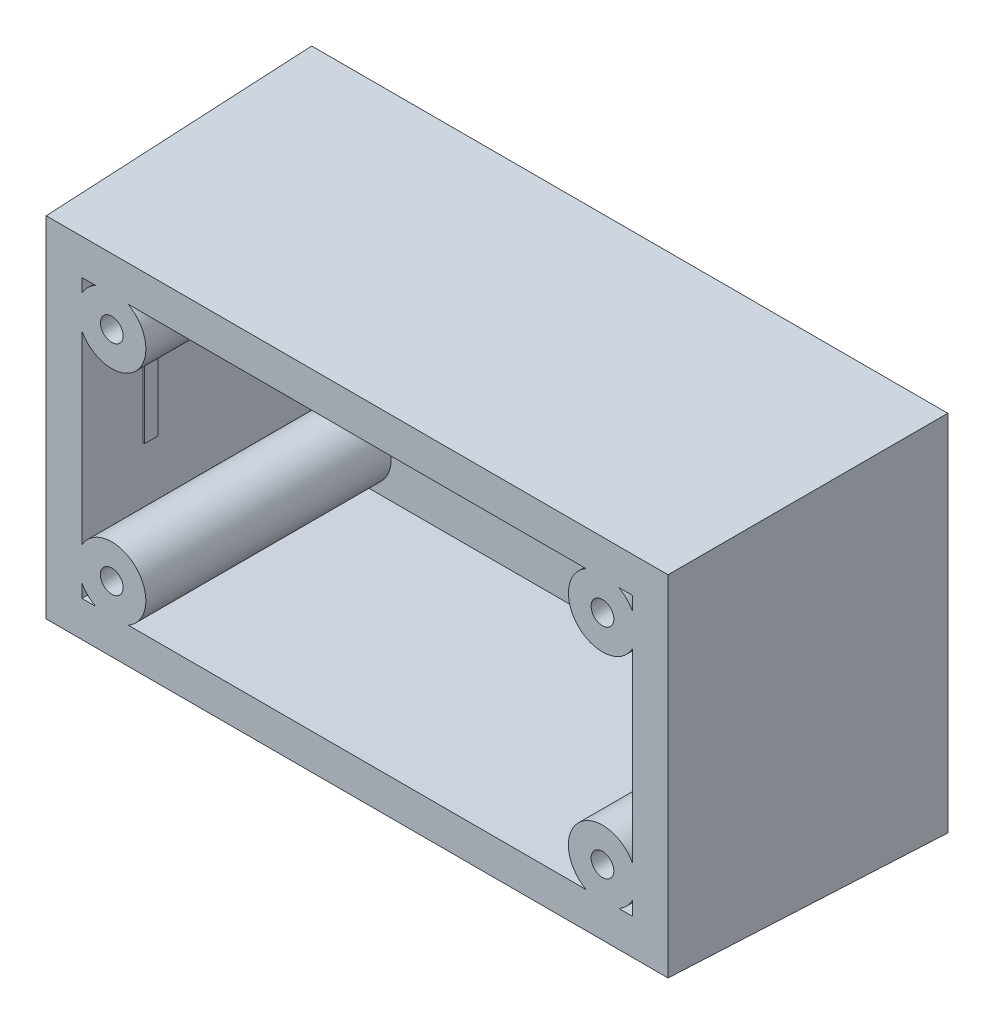
ISO-10303-21;
HEADER;
FILE_DESCRIPTION(('STEP AP214'),'2;1');
FILE_NAME('part.step','',(''),(''),'','','');
FILE_SCHEMA(('AUTOMOTIVE_DESIGN { 1 0 10303 214 1 1 1 1 }'));
ENDSEC;
DATA;
#1=APPLICATION_CONTEXT('core data for automotive mechanical design processes');
#2=APPLICATION_PROTOCOL_DEFINITION('international standard','automotive_design',2000,#1);
#3=PRODUCT_CONTEXT('',#1,'mechanical');
#4=PRODUCT('Part','Part','',(#3));
#5=PRODUCT_RELATED_PRODUCT_CATEGORY('part','',(#4));
#6=PRODUCT_DEFINITION_FORMATION('','',#4);
#7=PRODUCT_DEFINITION_CONTEXT('part definition',#1,'design');
#8=PRODUCT_DEFINITION('design','',#6,#7);
#9=PRODUCT_DEFINITION_SHAPE('','',#8);
#10=(LENGTH_UNIT() NAMED_UNIT(*) SI_UNIT(.MILLI.,.METRE.));
#11=(NAMED_UNIT(*) PLANE_ANGLE_UNIT() SI_UNIT($,.RADIAN.));
#12=(NAMED_UNIT(*) SI_UNIT($,.STERADIAN.) SOLID_ANGLE_UNIT());
#13=UNCERTAINTY_MEASURE_WITH_UNIT(LENGTH_MEASURE(1.E-05),#10,'distance_accuracy_value','');
#14=(GEOMETRIC_REPRESENTATION_CONTEXT(3) GLOBAL_UNCERTAINTY_ASSIGNED_CONTEXT((#13)) GLOBAL_UNIT_ASSIGNED_CONTEXT((#10,
#11,#12)) REPRESENTATION_CONTEXT('',''));
#15=CARTESIAN_POINT('',(0.,0.,0.));
#16=DIRECTION('',(0.,0.,1.));
#17=DIRECTION('',(1.,0.,0.));
#18=AXIS2_PLACEMENT_3D('',#15,#16,#17);
#19=CARTESIAN_POINT('',(31.,-16.,3.));
#20=DIRECTION('',(0.999657324975557,0.,0.0261769483078731));
#21=DIRECTION('',(0.0261769483078732,0.,-0.999657324975557));
#22=AXIS2_PLACEMENT_3D('',#19,#20,#21);
#23=PLANE('',#22);
#24=DIRECTION('',(0.,-1.,0.));
#25=VECTOR('',#24,1.);
#26=CARTESIAN_POINT('',(30.292980117632,0.,30.));
#27=LINE('',#26,#25);
#28=CARTESIAN_POINT('',(30.292980117632,-10.2059035854,30.));
#29=VERTEX_POINT('',#28);
#30=CARTESIAN_POINT('',(30.292980117632,10.2059035854,30.));
#31=VERTEX_POINT('',#30);
#32=EDGE_CURVE('E344',#29,#31,#27,.F.);
#33=ORIENTED_EDGE('',*,*,#32,.T.);
#34=CARTESIAN_POINT('',(27.,12.,155.753837188102));
#35=DIRECTION('',(0.999657324975557,0.,0.0261769483078731));
#36=DIRECTION('',(0.0261769483078732,0.,-0.999657324975557));
#37=AXIS2_PLACEMENT_3D('',#34,#35,#36);
#38=ELLIPSE('',#37,143.255812552914,3.75);
#39=CARTESIAN_POINT('',(30.292980117632,13.7940964146,30.));
#40=VERTEX_POINT('',#39);
#41=EDGE_CURVE('E258',#31,#40,#38,.T.);
#42=ORIENTED_EDGE('',*,*,#41,.T.);
#43=CARTESIAN_POINT('',(30.292980117632,15.292980117632,30.));
#44=VERTEX_POINT('',#43);
#45=EDGE_CURVE('E339',#40,#44,#27,.F.);
#46=ORIENTED_EDGE('',*,*,#45,.T.);
#47=DIRECTION('',(0.0261679842649793,0.0261679842649793,-0.99931500198837));
#48=VECTOR('',#47,1.);
#49=CARTESIAN_POINT('',(30.9575446691695,15.9575446691695,4.62130367336295));
#50=LINE('',#49,#48);
#51=CARTESIAN_POINT('',(31.,16.,3.));
#52=VERTEX_POINT('',#51);
#53=EDGE_CURVE('E327',#44,#52,#50,.T.);
#54=ORIENTED_EDGE('',*,*,#53,.T.);
#55=DIRECTION('',(0.,1.,0.));
#56=VECTOR('',#55,1.);
#57=CARTESIAN_POINT('',(31.,-16.,3.));
#58=LINE('',#57,#56);
#59=CARTESIAN_POINT('',(31.,-16.,3.));
#60=VERTEX_POINT('',#59);
#61=EDGE_CURVE('E314',#60,#52,#58,.T.);
#62=ORIENTED_EDGE('',*,*,#61,.F.);
#63=DIRECTION('',(0.0261679842649793,-0.0261679842649793,-0.99931500198837));
#64=VECTOR('',#63,1.);
#65=CARTESIAN_POINT('',(31.,-16.,3.));
#66=LINE('',#65,#64);
#67=CARTESIAN_POINT('',(30.292980117632,-15.292980117632,30.));
#68=VERTEX_POINT('',#67);
#69=EDGE_CURVE('E323',#68,#60,#66,.T.);
#70=ORIENTED_EDGE('',*,*,#69,.F.);
#71=CARTESIAN_POINT('',(30.292980117632,-13.7940964146,30.));
#72=VERTEX_POINT('',#71);
#73=EDGE_CURVE('E341',#68,#72,#27,.F.);
#74=ORIENTED_EDGE('',*,*,#73,.T.);
#75=CARTESIAN_POINT('',(27.,-12.,155.753837188102));
#76=DIRECTION('',(0.999657324975557,0.,0.0261769483078731));
#77=DIRECTION('',(0.0261769483078732,0.,-0.999657324975557));
#78=AXIS2_PLACEMENT_3D('',#75,#76,#77);
#79=ELLIPSE('',#78,143.255812552914,3.75);
#80=EDGE_CURVE('E271',#72,#29,#79,.T.);
#81=ORIENTED_EDGE('',*,*,#80,.T.);
#82=EDGE_LOOP('',(#33,#42,#46,#54,#62,#70,#74,#81));
#83=FACE_BOUND('',#82,.T.);
#84=DIRECTION('',(0.0261769483078732,0.,-0.999657324975557));
#85=VECTOR('',#84,1.);
#86=CARTESIAN_POINT('',(31.,4.,3.));
#87=LINE('',#86,#85);
#88=CARTESIAN_POINT('',(30.5129418588131,4.,21.6));
#89=VERTEX_POINT('',#88);
#90=CARTESIAN_POINT('',(30.4736629764593,4.,23.1));
#91=VERTEX_POINT('',#90);
#92=EDGE_CURVE('E59',#89,#91,#87,.F.);
#93=ORIENTED_EDGE('',*,*,#92,.T.);
#94=DIRECTION('',(0.,1.,0.));
#95=VECTOR('',#94,1.);
#96=CARTESIAN_POINT('',(30.4736629764593,-16.,23.1));
#97=LINE('',#96,#95);
#98=CARTESIAN_POINT('',(30.4736629764593,-4.,23.1));
#99=VERTEX_POINT('',#98);
#100=EDGE_CURVE('E11',#91,#99,#97,.F.);
#101=ORIENTED_EDGE('',*,*,#100,.T.);
#102=DIRECTION('',(-0.0261769483078732,0.,0.999657324975557));
#103=VECTOR('',#102,1.);
#104=CARTESIAN_POINT('',(31.,-4.,3.));
#105=LINE('',#104,#103);
#106=CARTESIAN_POINT('',(30.5129418588131,-4.,21.6));
#107=VERTEX_POINT('',#106);
#108=EDGE_CURVE('E49',#99,#107,#105,.F.);
#109=ORIENTED_EDGE('',*,*,#108,.T.);
#110=DIRECTION('',(0.,1.,0.));
#111=VECTOR('',#110,1.);
#112=CARTESIAN_POINT('',(30.5129418588131,-16.,21.6));
#113=LINE('',#112,#111);
#114=EDGE_CURVE('E397',#89,#107,#113,.F.);
#115=ORIENTED_EDGE('',*,*,#114,.F.);
#116=EDGE_LOOP('',(#93,#101,#109,#115));
#117=FACE_BOUND('',#116,.T.);
#118=ADVANCED_FACE('F41',(#83,#117),#23,.F.);
#119=CARTESIAN_POINT('',(-31.,-16.,3.));
#120=DIRECTION('',(-0.999657324975557,0.,0.0261769483078731));
#121=DIRECTION('',(0.0261769483078732,0.,0.999657324975557));
#122=AXIS2_PLACEMENT_3D('',#119,#120,#121);
#123=PLANE('',#122);
#124=DIRECTION('',(0.,1.,0.));
#125=VECTOR('',#124,1.);
#126=CARTESIAN_POINT('',(-30.292980117632,0.,30.));
#127=LINE('',#126,#125);
#128=CARTESIAN_POINT('',(-30.292980117632,15.292980117632,30.));
#129=VERTEX_POINT('',#128);
#130=CARTESIAN_POINT('',(-30.292980117632,13.7940964146,30.));
#131=VERTEX_POINT('',#130);
#132=EDGE_CURVE('E333',#129,#131,#127,.F.);
#133=ORIENTED_EDGE('',*,*,#132,.T.);
#134=CARTESIAN_POINT('',(-27.,12.,155.753837188102));
#135=DIRECTION('',(-0.999657324975557,0.,0.0261769483078731));
#136=DIRECTION('',(-0.0261769483078732,0.,-0.999657324975557));
#137=AXIS2_PLACEMENT_3D('',#134,#135,#136);
#138=ELLIPSE('',#137,143.255812552914,3.75);
#139=CARTESIAN_POINT('',(-30.292980117632,10.2059035854,30.));
#140=VERTEX_POINT('',#139);
#141=EDGE_CURVE('E290',#131,#140,#138,.T.);
#142=ORIENTED_EDGE('',*,*,#141,.T.);
#143=CARTESIAN_POINT('',(-30.292980117632,-10.2059035854,30.));
#144=VERTEX_POINT('',#143);
#145=EDGE_CURVE('E336',#140,#144,#127,.F.);
#146=ORIENTED_EDGE('',*,*,#145,.T.);
#147=CARTESIAN_POINT('',(-27.,-12.,155.753837188102));
#148=DIRECTION('',(-0.999657324975557,0.,0.0261769483078731));
#149=DIRECTION('',(-0.0261769483078732,0.,-0.999657324975557));
#150=AXIS2_PLACEMENT_3D('',#147,#148,#149);
#151=ELLIPSE('',#150,143.255812552914,3.75);
#152=CARTESIAN_POINT('',(-30.292980117632,-13.7940964146,30.));
#153=VERTEX_POINT('',#152);
#154=EDGE_CURVE('E306',#144,#153,#151,.T.);
#155=ORIENTED_EDGE('',*,*,#154,.T.);
#156=CARTESIAN_POINT('',(-30.292980117632,-15.292980117632,30.));
#157=VERTEX_POINT('',#156);
#158=EDGE_CURVE('E318',#153,#157,#127,.F.);
#159=ORIENTED_EDGE('',*,*,#158,.T.);
#160=DIRECTION('',(-0.0261679842649793,-0.0261679842649793,-0.99931500198837));
#161=VECTOR('',#160,1.);
#162=CARTESIAN_POINT('',(-31.,-16.,3.));
#163=LINE('',#162,#161);
#164=CARTESIAN_POINT('',(-31.,-16.,3.));
#165=VERTEX_POINT('',#164);
#166=EDGE_CURVE('E319',#157,#165,#163,.T.);
#167=ORIENTED_EDGE('',*,*,#166,.T.);
#168=DIRECTION('',(0.,-1.,0.));
#169=VECTOR('',#168,1.);
#170=CARTESIAN_POINT('',(-31.,-16.,3.));
#171=LINE('',#170,#169);
#172=CARTESIAN_POINT('',(-31.,16.,3.));
#173=VERTEX_POINT('',#172);
#174=EDGE_CURVE('E309',#173,#165,#171,.T.);
#175=ORIENTED_EDGE('',*,*,#174,.F.);
#176=DIRECTION('',(-0.0261679842649793,0.0261679842649793,-0.99931500198837));
#177=VECTOR('',#176,1.);
#178=CARTESIAN_POINT('',(-30.9780875711843,15.9780875711842,3.83680189592926));
#179=LINE('',#178,#177);
#180=EDGE_CURVE('E324',#129,#173,#179,.T.);
#181=ORIENTED_EDGE('',*,*,#180,.F.);
#182=EDGE_LOOP('',(#133,#142,#146,#155,#159,#167,#175,#181));
#183=FACE_BOUND('',#182,.T.);
#184=DIRECTION('',(-0.0261769483078732,0.,-0.999657324975557));
#185=VECTOR('',#184,1.);
#186=CARTESIAN_POINT('',(-31.,-4.,3.));
#187=LINE('',#186,#185);
#188=CARTESIAN_POINT('',(-30.5129418588131,-4.,21.6));
#189=VERTEX_POINT('',#188);
#190=CARTESIAN_POINT('',(-30.4736629764593,-4.,23.1));
#191=VERTEX_POINT('',#190);
#192=EDGE_CURVE('E393',#189,#191,#187,.F.);
#193=ORIENTED_EDGE('',*,*,#192,.T.);
#194=DIRECTION('',(0.,-1.,0.));
#195=VECTOR('',#194,1.);
#196=CARTESIAN_POINT('',(-30.4736629764593,-16.,23.1));
#197=LINE('',#196,#195);
#198=CARTESIAN_POINT('',(-30.4736629764593,4.,23.1));
#199=VERTEX_POINT('',#198);
#200=EDGE_CURVE('E395',#191,#199,#197,.F.);
#201=ORIENTED_EDGE('',*,*,#200,.T.);
#202=DIRECTION('',(0.0261769483078732,0.,0.999657324975557));
#203=VECTOR('',#202,1.);
#204=CARTESIAN_POINT('',(-31.,4.,3.));
#205=LINE('',#204,#203);
#206=CARTESIAN_POINT('',(-30.5129418588131,4.,21.6));
#207=VERTEX_POINT('',#206);
#208=EDGE_CURVE('E391',#199,#207,#205,.F.);
#209=ORIENTED_EDGE('',*,*,#208,.T.);
#210=DIRECTION('',(0.,-1.,0.));
#211=VECTOR('',#210,1.);
#212=CARTESIAN_POINT('',(-30.5129418588131,-16.,21.6));
#213=LINE('',#212,#211);
#214=EDGE_CURVE('E388',#189,#207,#213,.F.);
#215=ORIENTED_EDGE('',*,*,#214,.F.);
#216=EDGE_LOOP('',(#193,#201,#209,#215));
#217=FACE_BOUND('',#216,.T.);
#218=ADVANCED_FACE('F419',(#183,#217),#123,.F.);
#219=CARTESIAN_POINT('',(-31.,16.,3.));
#220=DIRECTION('',(0.,0.999657324975557,0.0261769483078731));
#221=DIRECTION('',(0.,-0.0261769483078732,0.999657324975557));
#222=AXIS2_PLACEMENT_3D('',#219,#220,#221);
#223=PLANE('',#222);
#224=DIRECTION('',(1.,0.,0.));
#225=VECTOR('',#224,1.);
#226=CARTESIAN_POINT('',(0.,15.292980117632,30.));
#227=LINE('',#226,#225);
#228=CARTESIAN_POINT('',(28.7940964146,15.292980117632,30.));
#229=VERTEX_POINT('',#228);
#230=EDGE_CURVE('E328',#44,#229,#227,.F.);
#231=ORIENTED_EDGE('',*,*,#230,.T.);
#232=CARTESIAN_POINT('',(27.,12.,155.753837188102));
#233=DIRECTION('',(0.,0.999657324975557,0.0261769483078731));
#234=DIRECTION('',(0.,0.0261769483078732,-0.999657324975557));
#235=AXIS2_PLACEMENT_3D('',#232,#233,#234);
#236=ELLIPSE('',#235,143.255812552914,3.75);
#237=CARTESIAN_POINT('',(25.2059035854,15.292980117632,30.));
#238=VERTEX_POINT('',#237);
#239=EDGE_CURVE('E255',#229,#238,#236,.T.);
#240=ORIENTED_EDGE('',*,*,#239,.T.);
#241=CARTESIAN_POINT('',(-25.2059035854,15.292980117632,30.));
#242=VERTEX_POINT('',#241);
#243=EDGE_CURVE('E346',#238,#242,#227,.F.);
#244=ORIENTED_EDGE('',*,*,#243,.T.);
#245=CARTESIAN_POINT('',(-27.,12.,155.753837188102));
#246=DIRECTION('',(0.,0.999657324975557,0.0261769483078731));
#247=DIRECTION('',(0.,0.0261769483078732,-0.999657324975557));
#248=AXIS2_PLACEMENT_3D('',#245,#246,#247);
#249=ELLIPSE('',#248,143.255812552914,3.75);
#250=CARTESIAN_POINT('',(-28.7940964146,15.292980117632,30.));
#251=VERTEX_POINT('',#250);
#252=EDGE_CURVE('E287',#242,#251,#249,.T.);
#253=ORIENTED_EDGE('',*,*,#252,.T.);
#254=EDGE_CURVE('E343',#251,#129,#227,.F.);
#255=ORIENTED_EDGE('',*,*,#254,.T.);
#256=ORIENTED_EDGE('',*,*,#180,.T.);
#257=DIRECTION('',(-1.,0.,0.));
#258=VECTOR('',#257,1.);
#259=CARTESIAN_POINT('',(-31.,16.,3.));
#260=LINE('',#259,#258);
#261=EDGE_CURVE('E316',#52,#173,#260,.T.);
#262=ORIENTED_EDGE('',*,*,#261,.F.);
#263=ORIENTED_EDGE('',*,*,#53,.F.);
#264=EDGE_LOOP('',(#231,#240,#244,#253,#255,#256,#262,#263));
#265=FACE_BOUND('',#264,.T.);
#266=ADVANCED_FACE('F427',(#265),#223,.F.);
#267=CARTESIAN_POINT('',(-31.,-16.,3.));
#268=DIRECTION('',(0.,-0.999657324975557,0.0261769483078731));
#269=DIRECTION('',(0.,-0.0261769483078732,-0.999657324975557));
#270=AXIS2_PLACEMENT_3D('',#267,#268,#269);
#271=PLANE('',#270);
#272=DIRECTION('',(-1.,0.,0.));
#273=VECTOR('',#272,1.);
#274=CARTESIAN_POINT('',(0.,-15.292980117632,30.));
#275=LINE('',#274,#273);
#276=CARTESIAN_POINT('',(-25.2059035854,-15.292980117632,30.));
#277=VERTEX_POINT('',#276);
#278=CARTESIAN_POINT('',(25.2059035854,-15.292980117632,30.));
#279=VERTEX_POINT('',#278);
#280=EDGE_CURVE('E340',#277,#279,#275,.F.);
#281=ORIENTED_EDGE('',*,*,#280,.T.);
#282=CARTESIAN_POINT('',(27.,-12.,155.753837188102));
#283=DIRECTION('',(0.,-0.999657324975557,0.0261769483078731));
#284=DIRECTION('',(0.,-0.0261769483078732,-0.999657324975557));
#285=AXIS2_PLACEMENT_3D('',#282,#283,#284);
#286=ELLIPSE('',#285,143.255812552914,3.75);
#287=CARTESIAN_POINT('',(28.7940964146,-15.292980117632,30.));
#288=VERTEX_POINT('',#287);
#289=EDGE_CURVE('E274',#279,#288,#286,.T.);
#290=ORIENTED_EDGE('',*,*,#289,.T.);
#291=EDGE_CURVE('E335',#288,#68,#275,.F.);
#292=ORIENTED_EDGE('',*,*,#291,.T.);
#293=ORIENTED_EDGE('',*,*,#69,.T.);
#294=DIRECTION('',(1.,0.,0.));
#295=VECTOR('',#294,1.);
#296=CARTESIAN_POINT('',(-31.,-16.,3.));
#297=LINE('',#296,#295);
#298=EDGE_CURVE('E312',#165,#60,#297,.T.);
#299=ORIENTED_EDGE('',*,*,#298,.F.);
#300=ORIENTED_EDGE('',*,*,#166,.F.);
#301=CARTESIAN_POINT('',(-28.7940964146,-15.292980117632,30.));
#302=VERTEX_POINT('',#301);
#303=EDGE_CURVE('E337',#157,#302,#275,.F.);
#304=ORIENTED_EDGE('',*,*,#303,.T.);
#305=CARTESIAN_POINT('',(-27.,-12.,155.753837188102));
#306=DIRECTION('',(0.,-0.999657324975557,0.0261769483078731));
#307=DIRECTION('',(0.,-0.0261769483078732,-0.999657324975557));
#308=AXIS2_PLACEMENT_3D('',#305,#306,#307);
#309=ELLIPSE('',#308,143.255812552914,3.75);
#310=EDGE_CURVE('E303',#302,#277,#309,.T.);
#311=ORIENTED_EDGE('',*,*,#310,.T.);
#312=EDGE_LOOP('',(#281,#290,#292,#293,#299,#300,#304,#311));
#313=FACE_BOUND('',#312,.T.);
#314=ADVANCED_FACE('F432',(#313),#271,.F.);
#315=CARTESIAN_POINT('',(0.,0.,30.));
#316=DIRECTION('',(0.,0.,-1.));
#317=DIRECTION('',(-1.,0.,0.));
#318=AXIS2_PLACEMENT_3D('',#315,#316,#317);
#319=PLANE('',#318);
#320=CARTESIAN_POINT('',(27.,12.,30.));
#321=DIRECTION('',(0.,0.,1.));
#322=DIRECTION('',(1.,0.,0.));
#323=AXIS2_PLACEMENT_3D('',#320,#321,#322);
#324=CIRCLE('',#323,1.25);
#325=CARTESIAN_POINT('',(28.25,12.,30.));
#326=VERTEX_POINT('',#325);
#327=EDGE_CURVE('E246',#326,#326,#324,.T.);
#328=ORIENTED_EDGE('',*,*,#327,.F.);
#329=EDGE_LOOP('',(#328));
#330=FACE_BOUND('',#329,.T.);
#331=ORIENTED_EDGE('',*,*,#45,.F.);
#332=CARTESIAN_POINT('',(27.,12.,30.));
#333=DIRECTION('',(0.,0.,1.));
#334=DIRECTION('',(1.,0.,0.));
#335=AXIS2_PLACEMENT_3D('',#332,#333,#334);
#336=CIRCLE('',#335,3.75);
#337=EDGE_CURVE('E252',#40,#229,#336,.T.);
#338=ORIENTED_EDGE('',*,*,#337,.T.);
#339=ORIENTED_EDGE('',*,*,#230,.F.);
#340=EDGE_LOOP('',(#331,#338,#339));
#341=FACE_BOUND('',#340,.T.);
#342=EDGE_CURVE('E249',#238,#31,#336,.T.);
#343=ORIENTED_EDGE('',*,*,#342,.T.);
#344=ORIENTED_EDGE('',*,*,#32,.F.);
#345=CARTESIAN_POINT('',(27.,-12.,30.));
#346=DIRECTION('',(0.,0.,1.));
#347=DIRECTION('',(1.,0.,0.));
#348=AXIS2_PLACEMENT_3D('',#345,#346,#347);
#349=CIRCLE('',#348,3.75);
#350=EDGE_CURVE('E268',#29,#279,#349,.T.);
#351=ORIENTED_EDGE('',*,*,#350,.T.);
#352=ORIENTED_EDGE('',*,*,#280,.F.);
#353=CARTESIAN_POINT('',(-27.,-12.,30.));
#354=DIRECTION('',(0.,0.,1.));
#355=DIRECTION('',(1.,0.,0.));
#356=AXIS2_PLACEMENT_3D('',#353,#354,#355);
#357=CIRCLE('',#356,3.75);
#358=EDGE_CURVE('E297',#277,#144,#357,.T.);
#359=ORIENTED_EDGE('',*,*,#358,.T.);
#360=ORIENTED_EDGE('',*,*,#145,.F.);
#361=CARTESIAN_POINT('',(-27.,12.,30.));
#362=DIRECTION('',(0.,0.,1.));
#363=DIRECTION('',(1.,0.,0.));
#364=AXIS2_PLACEMENT_3D('',#361,#362,#363);
#365=CIRCLE('',#364,3.75);
#366=EDGE_CURVE('E281',#140,#242,#365,.T.);
#367=ORIENTED_EDGE('',*,*,#366,.T.);
#368=ORIENTED_EDGE('',*,*,#243,.F.);
#369=EDGE_LOOP('',(#343,#344,#351,#352,#359,#360,#367,#368));
#370=FACE_BOUND('',#369,.T.);
#371=CARTESIAN_POINT('',(27.,-12.,30.));
#372=DIRECTION('',(0.,0.,1.));
#373=DIRECTION('',(1.,0.,0.));
#374=AXIS2_PLACEMENT_3D('',#371,#372,#373);
#375=CIRCLE('',#374,1.25);
#376=CARTESIAN_POINT('',(28.25,-12.,30.));
#377=VERTEX_POINT('',#376);
#378=EDGE_CURVE('E262',#377,#377,#375,.T.);
#379=ORIENTED_EDGE('',*,*,#378,.F.);
#380=EDGE_LOOP('',(#379));
#381=FACE_BOUND('',#380,.T.);
#382=ORIENTED_EDGE('',*,*,#291,.F.);
#383=EDGE_CURVE('E265',#288,#72,#349,.T.);
#384=ORIENTED_EDGE('',*,*,#383,.T.);
#385=ORIENTED_EDGE('',*,*,#73,.F.);
#386=EDGE_LOOP('',(#382,#384,#385));
#387=FACE_BOUND('',#386,.T.);
#388=CARTESIAN_POINT('',(-27.,12.,30.));
#389=DIRECTION('',(0.,0.,1.));
#390=DIRECTION('',(1.,0.,0.));
#391=AXIS2_PLACEMENT_3D('',#388,#389,#390);
#392=CIRCLE('',#391,1.25);
#393=CARTESIAN_POINT('',(-25.75,12.,30.));
#394=VERTEX_POINT('',#393);
#395=EDGE_CURVE('E278',#394,#394,#392,.T.);
#396=ORIENTED_EDGE('',*,*,#395,.F.);
#397=EDGE_LOOP('',(#396));
#398=FACE_BOUND('',#397,.T.);
#399=ORIENTED_EDGE('',*,*,#254,.F.);
#400=EDGE_CURVE('E286',#251,#131,#365,.T.);
#401=ORIENTED_EDGE('',*,*,#400,.T.);
#402=ORIENTED_EDGE('',*,*,#132,.F.);
#403=EDGE_LOOP('',(#399,#401,#402));
#404=FACE_BOUND('',#403,.T.);
#405=CARTESIAN_POINT('',(-27.,-12.,30.));
#406=DIRECTION('',(0.,0.,1.));
#407=DIRECTION('',(1.,0.,0.));
#408=AXIS2_PLACEMENT_3D('',#405,#406,#407);
#409=CIRCLE('',#408,1.25);
#410=CARTESIAN_POINT('',(-25.75,-12.,30.));
#411=VERTEX_POINT('',#410);
#412=EDGE_CURVE('E294',#411,#411,#409,.T.);
#413=ORIENTED_EDGE('',*,*,#412,.F.);
#414=EDGE_LOOP('',(#413));
#415=FACE_BOUND('',#414,.T.);
#416=EDGE_CURVE('E302',#153,#302,#357,.T.);
#417=ORIENTED_EDGE('',*,*,#416,.T.);
#418=ORIENTED_EDGE('',*,*,#303,.F.);
#419=ORIENTED_EDGE('',*,*,#158,.F.);
#420=EDGE_LOOP('',(#417,#418,#419));
#421=FACE_BOUND('',#420,.T.);
#422=DIRECTION('',(0.,1.,0.));
#423=VECTOR('',#422,1.);
#424=CARTESIAN_POINT('',(-34.2144223529244,0.,30.));
#425=LINE('',#424,#423);
#426=CARTESIAN_POINT('',(-34.2144223529244,19.2144223529244,30.));
#427=VERTEX_POINT('',#426);
#428=CARTESIAN_POINT('',(-34.2144223529244,-19.2144223529244,30.));
#429=VERTEX_POINT('',#428);
#430=EDGE_CURVE('E355',#427,#429,#425,.F.);
#431=ORIENTED_EDGE('',*,*,#430,.T.);
#432=DIRECTION('',(-1.,0.,0.));
#433=VECTOR('',#432,1.);
#434=CARTESIAN_POINT('',(0.,-19.2144223529244,30.));
#435=LINE('',#434,#433);
#436=CARTESIAN_POINT('',(34.2144223529244,-19.2144223529244,30.));
#437=VERTEX_POINT('',#436);
#438=EDGE_CURVE('E372',#429,#437,#435,.F.);
#439=ORIENTED_EDGE('',*,*,#438,.T.);
#440=DIRECTION('',(0.,-1.,0.));
#441=VECTOR('',#440,1.);
#442=CARTESIAN_POINT('',(34.2144223529244,0.,30.));
#443=LINE('',#442,#441);
#444=CARTESIAN_POINT('',(34.2144223529244,19.2144223529244,30.));
#445=VERTEX_POINT('',#444);
#446=EDGE_CURVE('E374',#437,#445,#443,.F.);
#447=ORIENTED_EDGE('',*,*,#446,.T.);
#448=DIRECTION('',(1.,0.,0.));
#449=VECTOR('',#448,1.);
#450=CARTESIAN_POINT('',(0.,19.2144223529244,30.));
#451=LINE('',#450,#449);
#452=EDGE_CURVE('E365',#445,#427,#451,.F.);
#453=ORIENTED_EDGE('',*,*,#452,.T.);
#454=EDGE_LOOP('',(#431,#439,#447,#453));
#455=FACE_BOUND('',#454,.T.);
#456=ADVANCED_FACE('F435',(#330,#341,#370,#381,#387,#398,#404,#415,#421,#455),#319,.F.);
#457=CARTESIAN_POINT('',(-35.,-20.,0.));
#458=DIRECTION('',(-0.999657324975557,0.,0.0261769483078731));
#459=DIRECTION('',(0.0261769483078732,0.,0.999657324975557));
#460=AXIS2_PLACEMENT_3D('',#457,#458,#459);
#461=PLANE('',#460);
#462=DIRECTION('',(0.,-1.,0.));
#463=VECTOR('',#462,1.);
#464=CARTESIAN_POINT('',(-35.,-20.,0.));
#465=LINE('',#464,#463);
#466=CARTESIAN_POINT('',(-35.,20.,0.));
#467=VERTEX_POINT('',#466);
#468=CARTESIAN_POINT('',(-35.,-20.,0.));
#469=VERTEX_POINT('',#468);
#470=EDGE_CURVE('E322',#467,#469,#465,.T.);
#471=ORIENTED_EDGE('',*,*,#470,.T.);
#472=DIRECTION('',(-0.0261679842649793,-0.0261679842649793,-0.99931500198837));
#473=VECTOR('',#472,1.);
#474=CARTESIAN_POINT('',(-35.,-20.,0.));
#475=LINE('',#474,#473);
#476=EDGE_CURVE('E356',#429,#469,#475,.T.);
#477=ORIENTED_EDGE('',*,*,#476,.F.);
#478=ORIENTED_EDGE('',*,*,#430,.F.);
#479=DIRECTION('',(-0.0261679842649793,0.0261679842649793,-0.99931500198837));
#480=VECTOR('',#479,1.);
#481=CARTESIAN_POINT('',(-34.9726094639803,19.9726094639803,1.04600236991158));
#482=LINE('',#481,#480);
#483=EDGE_CURVE('E361',#427,#467,#482,.T.);
#484=ORIENTED_EDGE('',*,*,#483,.T.);
#485=EDGE_LOOP('',(#471,#477,#478,#484));
#486=FACE_BOUND('',#485,.T.);
#487=ADVANCED_FACE('F439',(#486),#461,.T.);
#488=CARTESIAN_POINT('',(-35.,-20.,0.));
#489=DIRECTION('',(0.,-0.999657324975557,0.0261769483078731));
#490=DIRECTION('',(0.,-0.0261769483078732,-0.999657324975557));
#491=AXIS2_PLACEMENT_3D('',#488,#489,#490);
#492=PLANE('',#491);
#493=DIRECTION('',(1.,0.,0.));
#494=VECTOR('',#493,1.);
#495=CARTESIAN_POINT('',(-35.,-20.,0.));
#496=LINE('',#495,#494);
#497=CARTESIAN_POINT('',(35.,-20.,0.));
#498=VERTEX_POINT('',#497);
#499=EDGE_CURVE('E349',#469,#498,#496,.T.);
#500=ORIENTED_EDGE('',*,*,#499,.T.);
#501=DIRECTION('',(0.0261679842649793,-0.0261679842649793,-0.99931500198837));
#502=VECTOR('',#501,1.);
#503=CARTESIAN_POINT('',(35.,-20.,0.));
#504=LINE('',#503,#502);
#505=EDGE_CURVE('E360',#437,#498,#504,.T.);
#506=ORIENTED_EDGE('',*,*,#505,.F.);
#507=ORIENTED_EDGE('',*,*,#438,.F.);
#508=ORIENTED_EDGE('',*,*,#476,.T.);
#509=EDGE_LOOP('',(#500,#506,#507,#508));
#510=FACE_BOUND('',#509,.T.);
#511=ADVANCED_FACE('F43',(#510),#492,.T.);
#512=CARTESIAN_POINT('',(35.,-20.,0.));
#513=DIRECTION('',(0.999657324975557,0.,0.0261769483078731));
#514=DIRECTION('',(0.0261769483078732,0.,-0.999657324975557));
#515=AXIS2_PLACEMENT_3D('',#512,#513,#514);
#516=PLANE('',#515);
#517=DIRECTION('',(0.,1.,0.));
#518=VECTOR('',#517,1.);
#519=CARTESIAN_POINT('',(35.,-20.,0.));
#520=LINE('',#519,#518);
#521=CARTESIAN_POINT('',(35.,20.,0.));
#522=VERTEX_POINT('',#521);
#523=EDGE_CURVE('E351',#498,#522,#520,.T.);
#524=ORIENTED_EDGE('',*,*,#523,.T.);
#525=DIRECTION('',(0.0261679842649793,0.0261679842649793,-0.99931500198837));
#526=VECTOR('',#525,1.);
#527=CARTESIAN_POINT('',(34.9520665619656,19.9520665619655,1.83050414734526));
#528=LINE('',#527,#526);
#529=EDGE_CURVE('E364',#445,#522,#528,.T.);
#530=ORIENTED_EDGE('',*,*,#529,.F.);
#531=ORIENTED_EDGE('',*,*,#446,.F.);
#532=ORIENTED_EDGE('',*,*,#505,.T.);
#533=EDGE_LOOP('',(#524,#530,#531,#532));
#534=FACE_BOUND('',#533,.T.);
#535=ADVANCED_FACE('F451',(#534),#516,.T.);
#536=CARTESIAN_POINT('',(-35.,20.,0.));
#537=DIRECTION('',(0.,0.999657324975557,0.0261769483078731));
#538=DIRECTION('',(0.,-0.0261769483078732,0.999657324975557));
#539=AXIS2_PLACEMENT_3D('',#536,#537,#538);
#540=PLANE('',#539);
#541=DIRECTION('',(-1.,0.,0.));
#542=VECTOR('',#541,1.);
#543=CARTESIAN_POINT('',(-35.,20.,0.));
#544=LINE('',#543,#542);
#545=EDGE_CURVE('E353',#522,#467,#544,.T.);
#546=ORIENTED_EDGE('',*,*,#545,.T.);
#547=ORIENTED_EDGE('',*,*,#483,.F.);
#548=ORIENTED_EDGE('',*,*,#452,.F.);
#549=ORIENTED_EDGE('',*,*,#529,.T.);
#550=EDGE_LOOP('',(#546,#547,#548,#549));
#551=FACE_BOUND('',#550,.T.);
#552=ADVANCED_FACE('F445',(#551),#540,.T.);
#553=CARTESIAN_POINT('',(0.,0.,0.));
#554=DIRECTION('',(0.,0.,-1.));
#555=DIRECTION('',(-1.,0.,0.));
#556=AXIS2_PLACEMENT_3D('',#553,#554,#555);
#557=PLANE('',#556);
#558=ORIENTED_EDGE('',*,*,#470,.F.);
#559=ORIENTED_EDGE('',*,*,#545,.F.);
#560=ORIENTED_EDGE('',*,*,#523,.F.);
#561=ORIENTED_EDGE('',*,*,#499,.F.);
#562=EDGE_LOOP('',(#558,#559,#560,#561));
#563=FACE_BOUND('',#562,.T.);
#564=ADVANCED_FACE('F441',(#563),#557,.T.);
#565=CARTESIAN_POINT('',(0.,0.,3.));
#566=DIRECTION('',(0.,0.,-1.));
#567=DIRECTION('',(-1.,0.,0.));
#568=AXIS2_PLACEMENT_3D('',#565,#566,#567);
#569=PLANE('',#568);
#570=CARTESIAN_POINT('',(27.,12.,3.));
#571=DIRECTION('',(0.,0.,-1.));
#572=DIRECTION('',(-1.,0.,0.));
#573=AXIS2_PLACEMENT_3D('',#570,#571,#572);
#574=CIRCLE('',#573,3.75);
#575=CARTESIAN_POINT('',(23.25,12.,3.));
#576=VERTEX_POINT('',#575);
#577=EDGE_CURVE('E385',#576,#576,#574,.F.);
#578=ORIENTED_EDGE('',*,*,#577,.F.);
#579=EDGE_LOOP('',(#578));
#580=FACE_BOUND('',#579,.T.);
#581=CARTESIAN_POINT('',(27.,-12.,3.));
#582=DIRECTION('',(0.,0.,-1.));
#583=DIRECTION('',(-1.,0.,0.));
#584=AXIS2_PLACEMENT_3D('',#581,#582,#583);
#585=CIRCLE('',#584,3.75);
#586=CARTESIAN_POINT('',(23.25,-12.,3.));
#587=VERTEX_POINT('',#586);
#588=EDGE_CURVE('E382',#587,#587,#585,.F.);
#589=ORIENTED_EDGE('',*,*,#588,.F.);
#590=EDGE_LOOP('',(#589));
#591=FACE_BOUND('',#590,.T.);
#592=CARTESIAN_POINT('',(-27.,12.,3.));
#593=DIRECTION('',(0.,0.,-1.));
#594=DIRECTION('',(-1.,0.,0.));
#595=AXIS2_PLACEMENT_3D('',#592,#593,#594);
#596=CIRCLE('',#595,3.75);
#597=CARTESIAN_POINT('',(-30.75,12.,3.));
#598=VERTEX_POINT('',#597);
#599=EDGE_CURVE('E379',#598,#598,#596,.F.);
#600=ORIENTED_EDGE('',*,*,#599,.F.);
#601=EDGE_LOOP('',(#600));
#602=FACE_BOUND('',#601,.T.);
#603=CARTESIAN_POINT('',(-27.,-12.,3.));
#604=DIRECTION('',(0.,0.,-1.));
#605=DIRECTION('',(-1.,0.,0.));
#606=AXIS2_PLACEMENT_3D('',#603,#604,#605);
#607=CIRCLE('',#606,3.75);
#608=CARTESIAN_POINT('',(-30.75,-12.,3.));
#609=VERTEX_POINT('',#608);
#610=EDGE_CURVE('E359',#609,#609,#607,.F.);
#611=ORIENTED_EDGE('',*,*,#610,.F.);
#612=EDGE_LOOP('',(#611));
#613=FACE_BOUND('',#612,.T.);
#614=ORIENTED_EDGE('',*,*,#174,.T.);
#615=ORIENTED_EDGE('',*,*,#298,.T.);
#616=ORIENTED_EDGE('',*,*,#61,.T.);
#617=ORIENTED_EDGE('',*,*,#261,.T.);
#618=EDGE_LOOP('',(#614,#615,#616,#617));
#619=FACE_BOUND('',#618,.T.);
#620=ADVANCED_FACE('F444',(#580,#591,#602,#613,#619),#569,.F.);
#621=CARTESIAN_POINT('',(-27.,-12.,30.));
#622=DIRECTION('',(0.,0.,-1.));
#623=DIRECTION('',(-1.,0.,0.));
#624=AXIS2_PLACEMENT_3D('',#621,#622,#623);
#625=CYLINDRICAL_SURFACE('',#624,3.75);
#626=ORIENTED_EDGE('',*,*,#154,.F.);
#627=ORIENTED_EDGE('',*,*,#358,.F.);
#628=ORIENTED_EDGE('',*,*,#310,.F.);
#629=ORIENTED_EDGE('',*,*,#416,.F.);
#630=EDGE_LOOP('',(#626,#627,#628,#629));
#631=FACE_BOUND('',#630,.T.);
#632=ORIENTED_EDGE('',*,*,#610,.T.);
#633=EDGE_LOOP('',(#632));
#634=FACE_BOUND('',#633,.T.);
#635=ADVANCED_FACE('F511',(#631,#634),#625,.T.);
#636=CARTESIAN_POINT('',(-27.,-12.,30.));
#637=DIRECTION('',(0.,0.,-1.));
#638=DIRECTION('',(-1.,0.,0.));
#639=AXIS2_PLACEMENT_3D('',#636,#637,#638);
#640=CYLINDRICAL_SURFACE('',#639,1.25);
#641=ORIENTED_EDGE('',*,*,#412,.T.);
#642=EDGE_LOOP('',(#641));
#643=FACE_BOUND('',#642,.T.);
#644=CARTESIAN_POINT('',(-27.,-12.,3.));
#645=DIRECTION('',(0.,0.,1.));
#646=DIRECTION('',(1.,0.,0.));
#647=AXIS2_PLACEMENT_3D('',#644,#645,#646);
#648=CIRCLE('',#647,1.25);
#649=CARTESIAN_POINT('',(-25.75,-12.,3.));
#650=VERTEX_POINT('',#649);
#651=EDGE_CURVE('E293',#650,#650,#648,.T.);
#652=ORIENTED_EDGE('',*,*,#651,.F.);
#653=EDGE_LOOP('',(#652));
#654=FACE_BOUND('',#653,.T.);
#655=ADVANCED_FACE('F519',(#643,#654),#640,.F.);
#656=CARTESIAN_POINT('',(-27.,-12.,3.));
#657=DIRECTION('',(0.,0.,1.));
#658=DIRECTION('',(1.,0.,0.));
#659=AXIS2_PLACEMENT_3D('',#656,#657,#658);
#660=PLANE('',#659);
#661=ORIENTED_EDGE('',*,*,#651,.T.);
#662=EDGE_LOOP('',(#661));
#663=FACE_BOUND('',#662,.T.);
#664=ADVANCED_FACE('F528',(#663),#660,.T.);
#665=CARTESIAN_POINT('',(-27.,12.,30.));
#666=DIRECTION('',(0.,0.,-1.));
#667=DIRECTION('',(-1.,0.,0.));
#668=AXIS2_PLACEMENT_3D('',#665,#666,#667);
#669=CYLINDRICAL_SURFACE('',#668,3.75);
#670=ORIENTED_EDGE('',*,*,#141,.F.);
#671=ORIENTED_EDGE('',*,*,#400,.F.);
#672=ORIENTED_EDGE('',*,*,#252,.F.);
#673=ORIENTED_EDGE('',*,*,#366,.F.);
#674=EDGE_LOOP('',(#670,#671,#672,#673));
#675=FACE_BOUND('',#674,.T.);
#676=ORIENTED_EDGE('',*,*,#599,.T.);
#677=EDGE_LOOP('',(#676));
#678=FACE_BOUND('',#677,.T.);
#679=ADVANCED_FACE('F537',(#675,#678),#669,.T.);
#680=CARTESIAN_POINT('',(-27.,12.,30.));
#681=DIRECTION('',(0.,0.,-1.));
#682=DIRECTION('',(-1.,0.,0.));
#683=AXIS2_PLACEMENT_3D('',#680,#681,#682);
#684=CYLINDRICAL_SURFACE('',#683,1.25);
#685=ORIENTED_EDGE('',*,*,#395,.T.);
#686=EDGE_LOOP('',(#685));
#687=FACE_BOUND('',#686,.T.);
#688=CARTESIAN_POINT('',(-27.,12.,3.));
#689=DIRECTION('',(0.,0.,1.));
#690=DIRECTION('',(1.,0.,0.));
#691=AXIS2_PLACEMENT_3D('',#688,#689,#690);
#692=CIRCLE('',#691,1.25);
#693=CARTESIAN_POINT('',(-25.75,12.,3.));
#694=VERTEX_POINT('',#693);
#695=EDGE_CURVE('E277',#694,#694,#692,.T.);
#696=ORIENTED_EDGE('',*,*,#695,.F.);
#697=EDGE_LOOP('',(#696));
#698=FACE_BOUND('',#697,.T.);
#699=ADVANCED_FACE('F546',(#687,#698),#684,.F.);
#700=CARTESIAN_POINT('',(-27.,12.,3.));
#701=DIRECTION('',(0.,0.,1.));
#702=DIRECTION('',(1.,0.,0.));
#703=AXIS2_PLACEMENT_3D('',#700,#701,#702);
#704=PLANE('',#703);
#705=ORIENTED_EDGE('',*,*,#695,.T.);
#706=EDGE_LOOP('',(#705));
#707=FACE_BOUND('',#706,.T.);
#708=ADVANCED_FACE('F555',(#707),#704,.T.);
#709=CARTESIAN_POINT('',(27.,-12.,30.));
#710=DIRECTION('',(0.,0.,-1.));
#711=DIRECTION('',(-1.,0.,0.));
#712=AXIS2_PLACEMENT_3D('',#709,#710,#711);
#713=CYLINDRICAL_SURFACE('',#712,3.75);
#714=ORIENTED_EDGE('',*,*,#289,.F.);
#715=ORIENTED_EDGE('',*,*,#350,.F.);
#716=ORIENTED_EDGE('',*,*,#80,.F.);
#717=ORIENTED_EDGE('',*,*,#383,.F.);
#718=EDGE_LOOP('',(#714,#715,#716,#717));
#719=FACE_BOUND('',#718,.T.);
#720=ORIENTED_EDGE('',*,*,#588,.T.);
#721=EDGE_LOOP('',(#720));
#722=FACE_BOUND('',#721,.T.);
#723=ADVANCED_FACE('F564',(#719,#722),#713,.T.);
#724=CARTESIAN_POINT('',(27.,-12.,30.));
#725=DIRECTION('',(0.,0.,-1.));
#726=DIRECTION('',(-1.,0.,0.));
#727=AXIS2_PLACEMENT_3D('',#724,#725,#726);
#728=CYLINDRICAL_SURFACE('',#727,1.25);
#729=ORIENTED_EDGE('',*,*,#378,.T.);
#730=EDGE_LOOP('',(#729));
#731=FACE_BOUND('',#730,.T.);
#732=CARTESIAN_POINT('',(27.,-12.,3.));
#733=DIRECTION('',(0.,0.,1.));
#734=DIRECTION('',(1.,0.,0.));
#735=AXIS2_PLACEMENT_3D('',#732,#733,#734);
#736=CIRCLE('',#735,1.25);
#737=CARTESIAN_POINT('',(28.25,-12.,3.));
#738=VERTEX_POINT('',#737);
#739=EDGE_CURVE('E261',#738,#738,#736,.T.);
#740=ORIENTED_EDGE('',*,*,#739,.F.);
#741=EDGE_LOOP('',(#740));
#742=FACE_BOUND('',#741,.T.);
#743=ADVANCED_FACE('F579',(#731,#742),#728,.F.);
#744=CARTESIAN_POINT('',(27.,-12.,3.));
#745=DIRECTION('',(0.,0.,1.));
#746=DIRECTION('',(1.,0.,0.));
#747=AXIS2_PLACEMENT_3D('',#744,#745,#746);
#748=PLANE('',#747);
#749=ORIENTED_EDGE('',*,*,#739,.T.);
#750=EDGE_LOOP('',(#749));
#751=FACE_BOUND('',#750,.T.);
#752=ADVANCED_FACE('F588',(#751),#748,.T.);
#753=CARTESIAN_POINT('',(27.,12.,30.));
#754=DIRECTION('',(0.,0.,-1.));
#755=DIRECTION('',(-1.,0.,0.));
#756=AXIS2_PLACEMENT_3D('',#753,#754,#755);
#757=CYLINDRICAL_SURFACE('',#756,3.75);
#758=ORIENTED_EDGE('',*,*,#41,.F.);
#759=ORIENTED_EDGE('',*,*,#342,.F.);
#760=ORIENTED_EDGE('',*,*,#239,.F.);
#761=ORIENTED_EDGE('',*,*,#337,.F.);
#762=EDGE_LOOP('',(#758,#759,#760,#761));
#763=FACE_BOUND('',#762,.T.);
#764=ORIENTED_EDGE('',*,*,#577,.T.);
#765=EDGE_LOOP('',(#764));
#766=FACE_BOUND('',#765,.T.);
#767=ADVANCED_FACE('F597',(#763,#766),#757,.T.);
#768=CARTESIAN_POINT('',(27.,12.,30.));
#769=DIRECTION('',(0.,0.,-1.));
#770=DIRECTION('',(-1.,0.,0.));
#771=AXIS2_PLACEMENT_3D('',#768,#769,#770);
#772=CYLINDRICAL_SURFACE('',#771,1.25);
#773=ORIENTED_EDGE('',*,*,#327,.T.);
#774=EDGE_LOOP('',(#773));
#775=FACE_BOUND('',#774,.T.);
#776=CARTESIAN_POINT('',(27.,12.,3.));
#777=DIRECTION('',(0.,0.,1.));
#778=DIRECTION('',(1.,0.,0.));
#779=AXIS2_PLACEMENT_3D('',#776,#777,#778);
#780=CIRCLE('',#779,1.25);
#781=CARTESIAN_POINT('',(28.25,12.,3.));
#782=VERTEX_POINT('',#781);
#783=EDGE_CURVE('E245',#782,#782,#780,.T.);
#784=ORIENTED_EDGE('',*,*,#783,.F.);
#785=EDGE_LOOP('',(#784));
#786=FACE_BOUND('',#785,.T.);
#787=ADVANCED_FACE('F614',(#775,#786),#772,.F.);
#788=CARTESIAN_POINT('',(27.,12.,3.));
#789=DIRECTION('',(0.,0.,1.));
#790=DIRECTION('',(1.,0.,0.));
#791=AXIS2_PLACEMENT_3D('',#788,#789,#790);
#792=PLANE('',#791);
#793=ORIENTED_EDGE('',*,*,#783,.T.);
#794=EDGE_LOOP('',(#793));
#795=FACE_BOUND('',#794,.T.);
#796=ADVANCED_FACE('F623',(#795),#792,.T.);
#797=CARTESIAN_POINT('',(-32.4,-4.,23.1));
#798=DIRECTION('',(0.,1.,0.));
#799=DIRECTION('',(0.,0.,1.));
#800=AXIS2_PLACEMENT_3D('',#797,#798,#799);
#801=PLANE('',#800);
#802=ORIENTED_EDGE('',*,*,#192,.F.);
#803=DIRECTION('',(1.,0.,0.));
#804=VECTOR('',#803,1.);
#805=CARTESIAN_POINT('',(-32.4,-4.,21.6));
#806=LINE('',#805,#804);
#807=CARTESIAN_POINT('',(-30.292980117632,-4.,21.6));
#808=VERTEX_POINT('',#807);
#809=EDGE_CURVE('E220',#189,#808,#806,.T.);
#810=ORIENTED_EDGE('',*,*,#809,.T.);
#811=DIRECTION('',(0.,0.,-1.));
#812=VECTOR('',#811,1.);
#813=CARTESIAN_POINT('',(-30.292980117632,-4.,23.1));
#814=LINE('',#813,#812);
#815=CARTESIAN_POINT('',(-30.292980117632,-4.,23.1));
#816=VERTEX_POINT('',#815);
#817=EDGE_CURVE('E242',#816,#808,#814,.T.);
#818=ORIENTED_EDGE('',*,*,#817,.F.);
#819=DIRECTION('',(1.,0.,0.));
#820=VECTOR('',#819,1.);
#821=CARTESIAN_POINT('',(-32.4,-4.,23.1));
#822=LINE('',#821,#820);
#823=EDGE_CURVE('E228',#191,#816,#822,.T.);
#824=ORIENTED_EDGE('',*,*,#823,.F.);
#825=EDGE_LOOP('',(#802,#810,#818,#824));
#826=FACE_BOUND('',#825,.T.);
#827=ADVANCED_FACE('F632',(#826),#801,.F.);
#828=CARTESIAN_POINT('',(-30.292980117632,-4.,23.1));
#829=DIRECTION('',(-1.,0.,0.));
#830=DIRECTION('',(0.,0.,1.));
#831=AXIS2_PLACEMENT_3D('',#828,#829,#830);
#832=PLANE('',#831);
#833=DIRECTION('',(0.,1.,0.));
#834=VECTOR('',#833,1.);
#835=CARTESIAN_POINT('',(-30.292980117632,-4.,21.6));
#836=LINE('',#835,#834);
#837=CARTESIAN_POINT('',(-30.292980117632,4.,21.6));
#838=VERTEX_POINT('',#837);
#839=EDGE_CURVE('E223',#808,#838,#836,.T.);
#840=ORIENTED_EDGE('',*,*,#839,.T.);
#841=DIRECTION('',(0.,0.,-1.));
#842=VECTOR('',#841,1.);
#843=CARTESIAN_POINT('',(-30.292980117632,4.,23.1));
#844=LINE('',#843,#842);
#845=CARTESIAN_POINT('',(-30.292980117632,4.,23.1));
#846=VERTEX_POINT('',#845);
#847=EDGE_CURVE('E235',#846,#838,#844,.T.);
#848=ORIENTED_EDGE('',*,*,#847,.F.);
#849=DIRECTION('',(0.,1.,0.));
#850=VECTOR('',#849,1.);
#851=CARTESIAN_POINT('',(-30.292980117632,-4.,23.1));
#852=LINE('',#851,#850);
#853=EDGE_CURVE('E230',#816,#846,#852,.T.);
#854=ORIENTED_EDGE('',*,*,#853,.F.);
#855=ORIENTED_EDGE('',*,*,#817,.T.);
#856=EDGE_LOOP('',(#840,#848,#854,#855));
#857=FACE_BOUND('',#856,.T.);
#858=ADVANCED_FACE('F647',(#857),#832,.F.);
#859=CARTESIAN_POINT('',(-32.4,4.,23.1));
#860=DIRECTION('',(0.,-1.,0.));
#861=DIRECTION('',(0.,0.,-1.));
#862=AXIS2_PLACEMENT_3D('',#859,#860,#861);
#863=PLANE('',#862);
#864=ORIENTED_EDGE('',*,*,#208,.F.);
#865=DIRECTION('',(-1.,0.,0.));
#866=VECTOR('',#865,1.);
#867=CARTESIAN_POINT('',(-32.4,4.,23.1));
#868=LINE('',#867,#866);
#869=EDGE_CURVE('E233',#846,#199,#868,.T.);
#870=ORIENTED_EDGE('',*,*,#869,.F.);
#871=ORIENTED_EDGE('',*,*,#847,.T.);
#872=DIRECTION('',(-1.,0.,0.));
#873=VECTOR('',#872,1.);
#874=CARTESIAN_POINT('',(-32.4,4.,21.6));
#875=LINE('',#874,#873);
#876=EDGE_CURVE('E231',#838,#207,#875,.T.);
#877=ORIENTED_EDGE('',*,*,#876,.T.);
#878=EDGE_LOOP('',(#864,#870,#871,#877));
#879=FACE_BOUND('',#878,.T.);
#880=ADVANCED_FACE('F656',(#879),#863,.F.);
#881=CARTESIAN_POINT('',(0.,0.,23.1));
#882=DIRECTION('',(0.,0.,-1.));
#883=DIRECTION('',(-1.,0.,0.));
#884=AXIS2_PLACEMENT_3D('',#881,#882,#883);
#885=PLANE('',#884);
#886=ORIENTED_EDGE('',*,*,#200,.F.);
#887=ORIENTED_EDGE('',*,*,#823,.T.);
#888=ORIENTED_EDGE('',*,*,#853,.T.);
#889=ORIENTED_EDGE('',*,*,#869,.T.);
#890=EDGE_LOOP('',(#886,#887,#888,#889));
#891=FACE_BOUND('',#890,.T.);
#892=ADVANCED_FACE('F665',(#891),#885,.F.);
#893=CARTESIAN_POINT('',(0.,0.,21.6));
#894=DIRECTION('',(0.,0.,-1.));
#895=DIRECTION('',(-1.,0.,0.));
#896=AXIS2_PLACEMENT_3D('',#893,#894,#895);
#897=PLANE('',#896);
#898=ORIENTED_EDGE('',*,*,#809,.F.);
#899=ORIENTED_EDGE('',*,*,#214,.T.);
#900=ORIENTED_EDGE('',*,*,#876,.F.);
#901=ORIENTED_EDGE('',*,*,#839,.F.);
#902=EDGE_LOOP('',(#898,#899,#900,#901));
#903=FACE_BOUND('',#902,.T.);
#904=ADVANCED_FACE('F674',(#903),#897,.T.);
#905=CARTESIAN_POINT('',(30.292980117632,-4.,23.1));
#906=DIRECTION('',(1.,0.,0.));
#907=DIRECTION('',(0.,0.,-1.));
#908=AXIS2_PLACEMENT_3D('',#905,#906,#907);
#909=PLANE('',#908);
#910=DIRECTION('',(0.,-1.,0.));
#911=VECTOR('',#910,1.);
#912=CARTESIAN_POINT('',(30.292980117632,-4.,21.6));
#913=LINE('',#912,#911);
#914=CARTESIAN_POINT('',(30.292980117632,4.,21.6));
#915=VERTEX_POINT('',#914);
#916=CARTESIAN_POINT('',(30.292980117632,-4.,21.6));
#917=VERTEX_POINT('',#916);
#918=EDGE_CURVE('E219',#915,#917,#913,.T.);
#919=ORIENTED_EDGE('',*,*,#918,.T.);
#920=DIRECTION('',(0.,0.,-1.));
#921=VECTOR('',#920,1.);
#922=CARTESIAN_POINT('',(30.292980117632,-4.,23.1));
#923=LINE('',#922,#921);
#924=CARTESIAN_POINT('',(30.292980117632,-4.,23.1));
#925=VERTEX_POINT('',#924);
#926=EDGE_CURVE('E203',#925,#917,#923,.T.);
#927=ORIENTED_EDGE('',*,*,#926,.F.);
#928=DIRECTION('',(0.,-1.,0.));
#929=VECTOR('',#928,1.);
#930=CARTESIAN_POINT('',(30.292980117632,-4.,23.1));
#931=LINE('',#930,#929);
#932=CARTESIAN_POINT('',(30.292980117632,4.,23.1));
#933=VERTEX_POINT('',#932);
#934=EDGE_CURVE('E207',#933,#925,#931,.T.);
#935=ORIENTED_EDGE('',*,*,#934,.F.);
#936=DIRECTION('',(0.,0.,-1.));
#937=VECTOR('',#936,1.);
#938=CARTESIAN_POINT('',(30.292980117632,4.,23.1));
#939=LINE('',#938,#937);
#940=EDGE_CURVE('E221',#933,#915,#939,.T.);
#941=ORIENTED_EDGE('',*,*,#940,.T.);
#942=EDGE_LOOP('',(#919,#927,#935,#941));
#943=FACE_BOUND('',#942,.T.);
#944=ADVANCED_FACE('F217',(#943),#909,.F.);
#945=CARTESIAN_POINT('',(30.292980117632,-4.,23.1));
#946=DIRECTION('',(0.,1.,0.));
#947=DIRECTION('',(0.,0.,1.));
#948=AXIS2_PLACEMENT_3D('',#945,#946,#947);
#949=PLANE('',#948);
#950=ORIENTED_EDGE('',*,*,#108,.F.);
#951=DIRECTION('',(1.,0.,0.));
#952=VECTOR('',#951,1.);
#953=CARTESIAN_POINT('',(30.292980117632,-4.,23.1));
#954=LINE('',#953,#952);
#955=EDGE_CURVE('E198',#925,#99,#954,.T.);
#956=ORIENTED_EDGE('',*,*,#955,.F.);
#957=ORIENTED_EDGE('',*,*,#926,.T.);
#958=DIRECTION('',(1.,0.,0.));
#959=VECTOR('',#958,1.);
#960=CARTESIAN_POINT('',(30.292980117632,-4.,21.6));
#961=LINE('',#960,#959);
#962=EDGE_CURVE('E403',#917,#107,#961,.T.);
#963=ORIENTED_EDGE('',*,*,#962,.T.);
#964=EDGE_LOOP('',(#950,#956,#957,#963));
#965=FACE_BOUND('',#964,.T.);
#966=ADVANCED_FACE('F200',(#965),#949,.F.);
#967=CARTESIAN_POINT('',(30.292980117632,4.,23.1));
#968=DIRECTION('',(0.,-1.,0.));
#969=DIRECTION('',(0.,0.,-1.));
#970=AXIS2_PLACEMENT_3D('',#967,#968,#969);
#971=PLANE('',#970);
#972=ORIENTED_EDGE('',*,*,#92,.F.);
#973=DIRECTION('',(-1.,0.,0.));
#974=VECTOR('',#973,1.);
#975=CARTESIAN_POINT('',(30.292980117632,4.,21.6));
#976=LINE('',#975,#974);
#977=EDGE_CURVE('E215',#89,#915,#976,.T.);
#978=ORIENTED_EDGE('',*,*,#977,.T.);
#979=ORIENTED_EDGE('',*,*,#940,.F.);
#980=DIRECTION('',(-1.,0.,0.));
#981=VECTOR('',#980,1.);
#982=CARTESIAN_POINT('',(30.292980117632,4.,23.1));
#983=LINE('',#982,#981);
#984=EDGE_CURVE('E206',#91,#933,#983,.T.);
#985=ORIENTED_EDGE('',*,*,#984,.F.);
#986=EDGE_LOOP('',(#972,#978,#979,#985));
#987=FACE_BOUND('',#986,.T.);
#988=ADVANCED_FACE('F408',(#987),#971,.F.);
#989=CARTESIAN_POINT('',(0.,0.,23.1));
#990=DIRECTION('',(0.,0.,-1.));
#991=DIRECTION('',(-1.,0.,0.));
#992=AXIS2_PLACEMENT_3D('',#989,#990,#991);
#993=PLANE('',#992);
#994=ORIENTED_EDGE('',*,*,#100,.F.);
#995=ORIENTED_EDGE('',*,*,#984,.T.);
#996=ORIENTED_EDGE('',*,*,#934,.T.);
#997=ORIENTED_EDGE('',*,*,#955,.T.);
#998=EDGE_LOOP('',(#994,#995,#996,#997));
#999=FACE_BOUND('',#998,.T.);
#1000=ADVANCED_FACE('F210',(#999),#993,.F.);
#1001=CARTESIAN_POINT('',(0.,0.,21.6));
#1002=DIRECTION('',(0.,0.,-1.));
#1003=DIRECTION('',(-1.,0.,0.));
#1004=AXIS2_PLACEMENT_3D('',#1001,#1002,#1003);
#1005=PLANE('',#1004);
#1006=ORIENTED_EDGE('',*,*,#977,.F.);
#1007=ORIENTED_EDGE('',*,*,#114,.T.);
#1008=ORIENTED_EDGE('',*,*,#962,.F.);
#1009=ORIENTED_EDGE('',*,*,#918,.F.);
#1010=EDGE_LOOP('',(#1006,#1007,#1008,#1009));
#1011=FACE_BOUND('',#1010,.T.);
#1012=ADVANCED_FACE('F402',(#1011),#1005,.T.);
#1013=CLOSED_SHELL('',(#118,#218,#266,#314,#456,#487,#511,#535,#552,#564,#620,#635,#655,#664,
#679,#699,#708,#723,#743,#752,#767,#787,#796,#827,#858,#880,#892,#904,#944,#966,#988,#1000,#1012));
#1014=MANIFOLD_SOLID_BREP('B2',#1013);
#1015=ADVANCED_BREP_SHAPE_REPRESENTATION('',(#18,#1014),#14);
#1016=SHAPE_DEFINITION_REPRESENTATION(#9,#1015);
ENDSEC;
END-ISO-10303-21;
